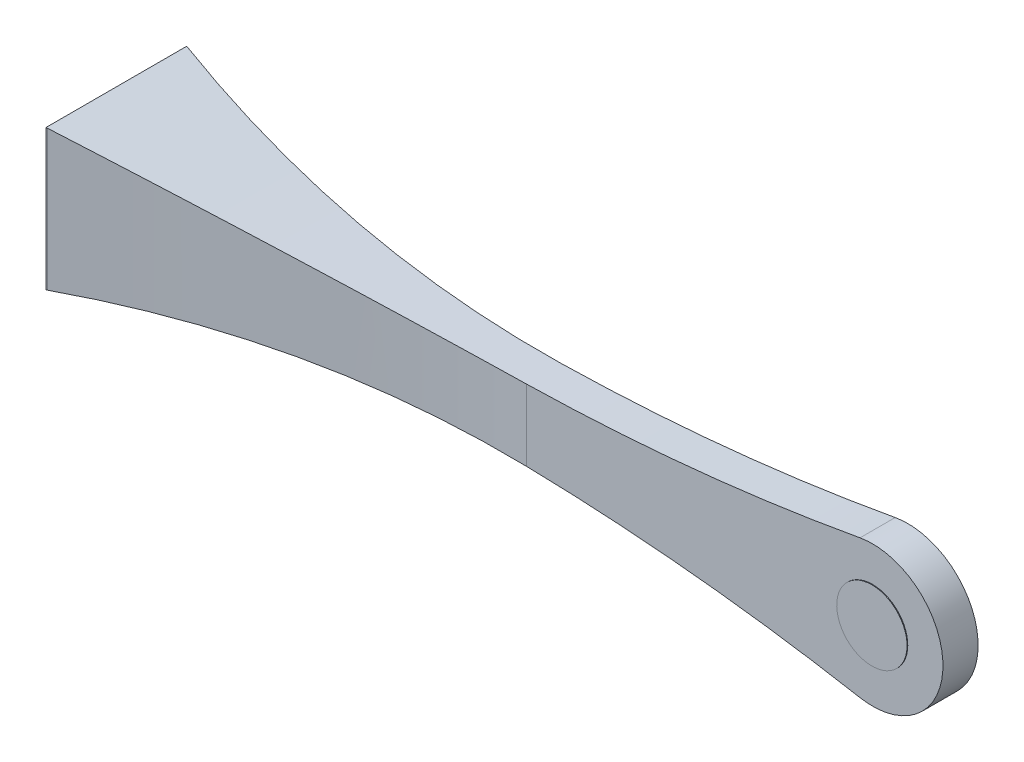
ISO-10303-21;
HEADER;
FILE_DESCRIPTION(('STEP AP214'),'2;1');
FILE_NAME('part.step','',(''),(''),'','','');
FILE_SCHEMA(('AUTOMOTIVE_DESIGN { 1 0 10303 214 1 1 1 1 }'));
ENDSEC;
DATA;
#1=APPLICATION_CONTEXT('core data for automotive mechanical design processes');
#2=APPLICATION_PROTOCOL_DEFINITION('international standard','automotive_design',2000,#1);
#3=PRODUCT_CONTEXT('',#1,'mechanical');
#4=PRODUCT('Part','Part','',(#3));
#5=PRODUCT_RELATED_PRODUCT_CATEGORY('part','',(#4));
#6=PRODUCT_DEFINITION_FORMATION('','',#4);
#7=PRODUCT_DEFINITION_CONTEXT('part definition',#1,'design');
#8=PRODUCT_DEFINITION('design','',#6,#7);
#9=PRODUCT_DEFINITION_SHAPE('','',#8);
#10=(LENGTH_UNIT() NAMED_UNIT(*) SI_UNIT(.MILLI.,.METRE.));
#11=(NAMED_UNIT(*) PLANE_ANGLE_UNIT() SI_UNIT($,.RADIAN.));
#12=(NAMED_UNIT(*) SI_UNIT($,.STERADIAN.) SOLID_ANGLE_UNIT());
#13=UNCERTAINTY_MEASURE_WITH_UNIT(LENGTH_MEASURE(1.E-05),#10,'distance_accuracy_value','');
#14=(GEOMETRIC_REPRESENTATION_CONTEXT(3) GLOBAL_UNCERTAINTY_ASSIGNED_CONTEXT((#13)) GLOBAL_UNIT_ASSIGNED_CONTEXT((#10,
#11,#12)) REPRESENTATION_CONTEXT('',''));
#15=CARTESIAN_POINT('',(0.,0.,0.));
#16=DIRECTION('',(0.,0.,1.));
#17=DIRECTION('',(1.,0.,0.));
#18=AXIS2_PLACEMENT_3D('',#15,#16,#17);
#19=CARTESIAN_POINT('',(-55.4545454545455,305.020661157025,2.50000000000107));
#20=DIRECTION('',(0.,0.,-1.));
#21=DIRECTION('',(0.,1.,0.));
#22=AXIS2_PLACEMENT_3D('',#19,#20,#21);
#23=PLANE('',#22);
#24=CARTESIAN_POINT('',(-55.4545454545455,305.020661157025,2.50000000000107));
#25=DIRECTION('',(0.,0.,-1.));
#26=DIRECTION('',(0.,1.,0.));
#27=AXIS2_PLACEMENT_3D('',#24,#25,#26);
#28=CIRCLE('',#27,300.020661157025);
#29=CARTESIAN_POINT('',(-1.78873708763747,9.83872042652454,2.50000000000003));
#30=VERTEX_POINT('',#29);
#31=CARTESIAN_POINT('',(-49.2235935955851,5.06471045754363,2.50000000000002));
#32=VERTEX_POINT('',#31);
#33=EDGE_CURVE('E163',#30,#32,#28,.T.);
#34=ORIENTED_EDGE('',*,*,#33,.T.);
#35=DIRECTION('',(0.,-1.,0.));
#36=VECTOR('',#35,1.);
#37=CARTESIAN_POINT('',(-49.2235935955851,-6.00574884953593,2.49999999999998));
#38=LINE('',#37,#36);
#39=CARTESIAN_POINT('',(-49.2235935955851,-5.06471045754365,2.49999999999998));
#40=VERTEX_POINT('',#39);
#41=EDGE_CURVE('E182',#32,#40,#38,.T.);
#42=ORIENTED_EDGE('',*,*,#41,.T.);
#43=CARTESIAN_POINT('',(-55.4545454545454,-305.020661157025,2.49999999999894));
#44=DIRECTION('',(0.,0.,-1.));
#45=DIRECTION('',(0.,-1.,0.));
#46=AXIS2_PLACEMENT_3D('',#43,#44,#45);
#47=CIRCLE('',#46,300.020661157025);
#48=CARTESIAN_POINT('',(-1.78873708763746,-9.83872042652456,2.49999999999997));
#49=VERTEX_POINT('',#48);
#50=EDGE_CURVE('E165',#40,#49,#47,.T.);
#51=ORIENTED_EDGE('',*,*,#50,.T.);
#52=CARTESIAN_POINT('',(0.,0.,2.5));
#53=DIRECTION('',(0.,0.,1.));
#54=DIRECTION('',(0.,1.,0.));
#55=AXIS2_PLACEMENT_3D('',#52,#53,#54);
#56=CIRCLE('',#55,10.0000000000001);
#57=EDGE_CURVE('E170',#49,#30,#56,.T.);
#58=ORIENTED_EDGE('',*,*,#57,.T.);
#59=EDGE_LOOP('',(#34,#42,#51,#58));
#60=FACE_BOUND('',#59,.T.);
#61=CARTESIAN_POINT('',(0.,0.,2.5));
#62=DIRECTION('',(0.,0.,1.));
#63=DIRECTION('',(0.,-1.,0.));
#64=AXIS2_PLACEMENT_3D('',#61,#62,#63);
#65=CIRCLE('',#64,5.);
#66=CARTESIAN_POINT('',(0.,-5.00000000000001,2.49999999999998));
#67=VERTEX_POINT('',#66);
#68=EDGE_CURVE('E160',#67,#67,#65,.T.);
#69=ORIENTED_EDGE('',*,*,#68,.F.);
#70=EDGE_LOOP('',(#69));
#71=FACE_BOUND('',#70,.T.);
#72=ADVANCED_FACE('F49',(#60,#71),#23,.F.);
#73=CARTESIAN_POINT('',(-55.4545454545455,305.020661157025,-2.49999999999894));
#74=DIRECTION('',(0.,0.,-1.));
#75=DIRECTION('',(0.,1.,0.));
#76=AXIS2_PLACEMENT_3D('',#73,#74,#75);
#77=PLANE('',#76);
#78=CARTESIAN_POINT('',(-55.4545454545454,-305.020661157025,-2.50000000000107));
#79=DIRECTION('',(0.,0.,-1.));
#80=DIRECTION('',(0.,-1.,0.));
#81=AXIS2_PLACEMENT_3D('',#78,#79,#80);
#82=CIRCLE('',#81,300.020661157025);
#83=CARTESIAN_POINT('',(-49.223593595585,-5.06471045754363,-2.50000000000002));
#84=VERTEX_POINT('',#83);
#85=CARTESIAN_POINT('',(-1.78873708763746,-9.83872042652454,-2.50000000000003));
#86=VERTEX_POINT('',#85);
#87=EDGE_CURVE('E171',#84,#86,#82,.T.);
#88=ORIENTED_EDGE('',*,*,#87,.F.);
#89=DIRECTION('',(0.,-1.,0.));
#90=VECTOR('',#89,1.);
#91=CARTESIAN_POINT('',(-49.223593595585,305.020661157025,-2.49999999999894));
#92=LINE('',#91,#90);
#93=CARTESIAN_POINT('',(-49.223593595585,5.06471045754365,-2.49999999999998));
#94=VERTEX_POINT('',#93);
#95=EDGE_CURVE('E189',#84,#94,#92,.F.);
#96=ORIENTED_EDGE('',*,*,#95,.T.);
#97=CARTESIAN_POINT('',(-55.4545454545455,305.020661157025,-2.49999999999894));
#98=DIRECTION('',(0.,0.,-1.));
#99=DIRECTION('',(0.,1.,0.));
#100=AXIS2_PLACEMENT_3D('',#97,#98,#99);
#101=CIRCLE('',#100,300.020661157025);
#102=CARTESIAN_POINT('',(-1.78873708763747,9.83872042652455,-2.49999999999997));
#103=VERTEX_POINT('',#102);
#104=EDGE_CURVE('E156',#103,#94,#101,.T.);
#105=ORIENTED_EDGE('',*,*,#104,.F.);
#106=CARTESIAN_POINT('',(0.,0.,-2.5));
#107=DIRECTION('',(0.,0.,1.));
#108=DIRECTION('',(0.,1.,0.));
#109=AXIS2_PLACEMENT_3D('',#106,#107,#108);
#110=CIRCLE('',#109,10.0000000000001);
#111=EDGE_CURVE('E164',#86,#103,#110,.T.);
#112=ORIENTED_EDGE('',*,*,#111,.F.);
#113=EDGE_LOOP('',(#88,#96,#105,#112));
#114=FACE_BOUND('',#113,.T.);
#115=CARTESIAN_POINT('',(0.,0.,-2.5));
#116=DIRECTION('',(0.,0.,-1.));
#117=DIRECTION('',(0.,1.,0.));
#118=AXIS2_PLACEMENT_3D('',#115,#116,#117);
#119=CIRCLE('',#118,5.);
#120=CARTESIAN_POINT('',(0.,5.00000000000001,-2.49999999999998));
#121=VERTEX_POINT('',#120);
#122=EDGE_CURVE('E153',#121,#121,#119,.F.);
#123=ORIENTED_EDGE('',*,*,#122,.T.);
#124=EDGE_LOOP('',(#123));
#125=FACE_BOUND('',#124,.T.);
#126=ADVANCED_FACE('F221',(#114,#125),#77,.T.);
#127=CARTESIAN_POINT('',(-55.4545454545455,305.020661157025,2.50000000000107));
#128=DIRECTION('',(0.,0.,-1.));
#129=DIRECTION('',(0.,1.,0.));
#130=AXIS2_PLACEMENT_3D('',#127,#128,#129);
#131=CYLINDRICAL_SURFACE('',#130,300.020661157025);
#132=ORIENTED_EDGE('',*,*,#104,.T.);
#133=CARTESIAN_POINT('',(-49.223593595585,5.06471045754365,-2.49999999999998));
#134=CARTESIAN_POINT('',(-50.5094833667524,5.03799734430642,-2.4999988111242));
#135=CARTESIAN_POINT('',(-51.7955093690425,5.01955718244819,-2.50992160296873));
#136=CARTESIAN_POINT('',(-54.3673848533679,4.99921380423304,-2.54961407652035));
#137=CARTESIAN_POINT('',(-55.6532343355444,4.99731057456236,-2.57938374224884));
#138=CARTESIAN_POINT('',(-59.5096731019534,5.01639193986034,-2.69845607791141));
#139=CARTESIAN_POINT('',(-62.0793274092757,5.06216396496447,-2.81752208663287));
#140=CARTESIAN_POINT('',(-67.1958716472145,5.21897727917521,-3.13374890342736));
#141=CARTESIAN_POINT('',(-69.7428044056206,5.32961556237744,-3.33042508376594));
#142=CARTESIAN_POINT('',(-74.8258782215376,5.61520336530785,-3.80131155859663));
#143=CARTESIAN_POINT('',(-77.3620193176332,5.79015265490064,-4.07552157563496));
#144=CARTESIAN_POINT('',(-82.4194635886218,6.20344766291101,-4.70063360314545));
#145=CARTESIAN_POINT('',(-84.9407676772623,6.441789434596,-5.05153083892977));
#146=CARTESIAN_POINT('',(-89.9650252313705,6.98071770715919,-5.82896781371866));
#147=CARTESIAN_POINT('',(-92.4679784044726,7.2813051975111,-6.25550875515926));
#148=CARTESIAN_POINT('',(-97.4673887478705,7.94539358243608,-7.18583435993211));
#149=CARTESIAN_POINT('',(-99.9637094598861,8.30927293750086,-7.69008147971291));
#150=CARTESIAN_POINT('',(-104.930672061337,9.09695622699466,-8.77231012271923));
#151=CARTESIAN_POINT('',(-107.401315089459,9.52075749188678,-9.35028836109186));
#152=CARTESIAN_POINT('',(-109.857499854669,9.97368917860187,-9.96437496366719));
#153=B_SPLINE_CURVE_WITH_KNOTS('',3,(#133,#134,#135,#136,#137,#138,#139,#140,#141,#142,#143,
#144,#145,#146,#147,#148,#149,#150,#151,#152),.UNSPECIFIED.,.F.,.F.,(4,2,2,2,2,2,2,2,2,4),(0.,
3.85836555019018,7.71672799403778,15.432929042457,23.1016908419773,30.7704251992854,
38.4386822229894,46.1070611526087,53.8229778084948,61.5385508265014),.UNSPECIFIED.);
#154=CARTESIAN_POINT('',(-109.857499854669,9.97368917860184,-9.96437496366718));
#155=VERTEX_POINT('',#154);
#156=EDGE_CURVE('E63',#94,#155,#153,.T.);
#157=ORIENTED_EDGE('',*,*,#156,.T.);
#158=CARTESIAN_POINT('',(-55.4545454545455,305.020661157025,3.63636363636488));
#159=DIRECTION('',(0.242535625036336,0.,-0.970142500145331));
#160=DIRECTION('',(-0.970142500145331,0.,-0.242535625036336));
#161=AXIS2_PLACEMENT_3D('',#158,#159,#160);
#162=ELLIPSE('',#161,309.254218954515,300.020661157025);
#163=CARTESIAN_POINT('',(-110.,10.0000000000001,-10.));
#164=VERTEX_POINT('',#163);
#165=EDGE_CURVE('E129',#155,#164,#162,.T.);
#166=ORIENTED_EDGE('',*,*,#165,.T.);
#167=DIRECTION('',(0.,0.,-1.));
#168=VECTOR('',#167,1.);
#169=CARTESIAN_POINT('',(-110.,9.99999999999998,2.50000000000004));
#170=LINE('',#169,#168);
#171=CARTESIAN_POINT('',(-110.,10.,10.0000000000001));
#172=VERTEX_POINT('',#171);
#173=EDGE_CURVE('E137',#172,#164,#170,.T.);
#174=ORIENTED_EDGE('',*,*,#173,.F.);
#175=CARTESIAN_POINT('',(-55.4545454545455,305.020661157025,-3.63636363636275));
#176=DIRECTION('',(-0.242535625036336,0.,-0.970142500145331));
#177=DIRECTION('',(0.970142500145331,0.,-0.242535625036336));
#178=AXIS2_PLACEMENT_3D('',#175,#176,#177);
#179=ELLIPSE('',#178,309.254218954515,300.020661157025);
#180=CARTESIAN_POINT('',(-109.857499854669,9.97368917860183,9.96437496366731));
#181=VERTEX_POINT('',#180);
#182=EDGE_CURVE('E128',#172,#181,#179,.F.);
#183=ORIENTED_EDGE('',*,*,#182,.T.);
#184=CARTESIAN_POINT('',(-109.857499854669,9.97368917860183,9.96437496366729));
#185=CARTESIAN_POINT('',(-107.401315089459,9.52075749188678,9.35028836109186));
#186=CARTESIAN_POINT('',(-104.930672061337,9.09695622699465,8.77231012271923));
#187=CARTESIAN_POINT('',(-99.9637094598862,8.3092729375008,7.69008147971294));
#188=CARTESIAN_POINT('',(-97.4673887478706,7.94539358243599,7.18583435993218));
#189=CARTESIAN_POINT('',(-92.4679784044727,7.28130519751106,6.2555087551593));
#190=CARTESIAN_POINT('',(-89.9650252313707,6.98071770715922,5.82896781371865));
#191=CARTESIAN_POINT('',(-84.9407676772624,6.44178943459602,5.05153083892975));
#192=CARTESIAN_POINT('',(-82.419463588622,6.20344766291095,4.70063360314548));
#193=CARTESIAN_POINT('',(-77.3620193176333,5.79015265490054,4.07552157563499));
#194=CARTESIAN_POINT('',(-74.8258782215377,5.6152033653078,3.80131155859662));
#195=CARTESIAN_POINT('',(-69.7428044056207,5.32961556237746,3.33042508376591));
#196=CARTESIAN_POINT('',(-67.1958716472146,5.21897727917526,3.13374890342734));
#197=CARTESIAN_POINT('',(-62.0793274092759,5.06216396496452,2.81752208663288));
#198=CARTESIAN_POINT('',(-59.5096731019535,5.01639193986037,2.69845607791144));
#199=CARTESIAN_POINT('',(-55.6532343355445,4.99731057456236,2.57938374224882));
#200=CARTESIAN_POINT('',(-54.367384853368,4.99921380423303,2.5496140765203));
#201=CARTESIAN_POINT('',(-51.7955093690426,5.01955718244817,2.50992160296868));
#202=CARTESIAN_POINT('',(-50.5094833667525,5.0379973443064,2.49999881112416));
#203=CARTESIAN_POINT('',(-49.2235935955851,5.06471045754363,2.50000000000002));
#204=B_SPLINE_CURVE_WITH_KNOTS('',3,(#184,#185,#186,#187,#188,#189,#190,#191,#192,#193,#194,
#195,#196,#197,#198,#199,#200,#201,#202,#203),.UNSPECIFIED.,.F.,.F.,(4,2,2,2,2,2,2,2,2,4),(0.,
7.71557301800658,15.4314896738927,23.099868603512,30.768125627216,38.4368599845241,
46.1056217840444,53.8218228324636,57.6801852763112,61.5385508265014),.UNSPECIFIED.);
#205=EDGE_CURVE('E200',#181,#32,#204,.T.);
#206=ORIENTED_EDGE('',*,*,#205,.T.);
#207=ORIENTED_EDGE('',*,*,#33,.F.);
#208=DIRECTION('',(0.,0.,-1.));
#209=VECTOR('',#208,1.);
#210=CARTESIAN_POINT('',(-1.78873708763747,9.83872042652454,2.50000000000003));
#211=LINE('',#210,#209);
#212=EDGE_CURVE('E169',#30,#103,#211,.T.);
#213=ORIENTED_EDGE('',*,*,#212,.T.);
#214=EDGE_LOOP('',(#132,#157,#166,#174,#183,#206,#207,#213));
#215=FACE_BOUND('',#214,.T.);
#216=ADVANCED_FACE('F225',(#215),#131,.F.);
#217=CARTESIAN_POINT('',(-55.4545454545454,-305.020661157025,2.49999999999894));
#218=DIRECTION('',(0.,0.,-1.));
#219=DIRECTION('',(0.,1.,0.));
#220=AXIS2_PLACEMENT_3D('',#217,#218,#219);
#221=CYLINDRICAL_SURFACE('',#220,300.020661157025);
#222=DIRECTION('',(0.,0.,-1.));
#223=VECTOR('',#222,1.);
#224=CARTESIAN_POINT('',(-110.,-10.0000000000001,2.49999999999996));
#225=LINE('',#224,#223);
#226=CARTESIAN_POINT('',(-110.,-10.0000000000001,10.));
#227=VERTEX_POINT('',#226);
#228=CARTESIAN_POINT('',(-110.,-10.,-10.0000000000001));
#229=VERTEX_POINT('',#228);
#230=EDGE_CURVE('E124',#227,#229,#225,.T.);
#231=ORIENTED_EDGE('',*,*,#230,.T.);
#232=CARTESIAN_POINT('',(-55.4545454545454,-305.020661157025,3.63636363636277));
#233=DIRECTION('',(0.242535625036336,0.,-0.970142500145331));
#234=DIRECTION('',(-0.970142500145331,0.,-0.242535625036336));
#235=AXIS2_PLACEMENT_3D('',#232,#233,#234);
#236=ELLIPSE('',#235,309.254218954515,300.020661157025);
#237=CARTESIAN_POINT('',(-109.857499854669,-9.97368917860183,-9.96437496366728));
#238=VERTEX_POINT('',#237);
#239=EDGE_CURVE('E177',#229,#238,#236,.T.);
#240=ORIENTED_EDGE('',*,*,#239,.T.);
#241=CARTESIAN_POINT('',(-109.857499854669,-9.97368917860183,-9.96437496366728));
#242=CARTESIAN_POINT('',(-107.401315089459,-9.52075749188677,-9.35028836109183));
#243=CARTESIAN_POINT('',(-104.930672061337,-9.0969562269946,-8.7723101227192));
#244=CARTESIAN_POINT('',(-99.9637094598861,-8.30927293750072,-7.69008147971295));
#245=CARTESIAN_POINT('',(-97.4673887478705,-7.94539358243591,-7.18583435993222));
#246=CARTESIAN_POINT('',(-92.4679784044726,-7.28130519751102,-6.25550875515936));
#247=CARTESIAN_POINT('',(-89.9650252313706,-6.98071770715923,-5.82896781371869));
#248=CARTESIAN_POINT('',(-84.9407676772623,-6.44178943459605,-5.05153083892977));
#249=CARTESIAN_POINT('',(-82.4194635886219,-6.20344766291095,-4.70063360314548));
#250=CARTESIAN_POINT('',(-77.3620193176332,-5.79015265490053,-4.075521575635));
#251=CARTESIAN_POINT('',(-74.8258782215376,-5.6152033653078,-3.80131155859665));
#252=CARTESIAN_POINT('',(-69.7428044056206,-5.32961556237747,-3.33042508376594));
#253=CARTESIAN_POINT('',(-67.1958716472145,-5.21897727917526,-3.13374890342736));
#254=CARTESIAN_POINT('',(-62.0793274092757,-5.06216396496452,-2.81752208663289));
#255=CARTESIAN_POINT('',(-59.5096731019534,-5.01639193986036,-2.69845607791146));
#256=CARTESIAN_POINT('',(-55.6532343355444,-4.99731057456234,-2.57938374224885));
#257=CARTESIAN_POINT('',(-54.3673848533679,-4.99921380423302,-2.54961407652034));
#258=CARTESIAN_POINT('',(-51.7955093690425,-5.01955718244816,-2.50992160296871));
#259=CARTESIAN_POINT('',(-50.5094833667523,-5.03799734430639,-2.4999988111242));
#260=CARTESIAN_POINT('',(-49.2235935955849,-5.06471045754362,-2.50000000000004));
#261=B_SPLINE_CURVE_WITH_KNOTS('',3,(#241,#242,#243,#244,#245,#246,#247,#248,#249,#250,#251,
#252,#253,#254,#255,#256,#257,#258,#259,#260),.UNSPECIFIED.,.F.,.F.,(4,2,2,2,2,2,2,2,2,4),(0.,
7.71557301800659,15.4314896738927,23.099868603512,30.768125627216,38.4368599845241,
46.1056217840445,53.8218228324637,57.6801852763113,61.5385508265015),.UNSPECIFIED.);
#262=EDGE_CURVE('E12',#238,#84,#261,.T.);
#263=ORIENTED_EDGE('',*,*,#262,.T.);
#264=ORIENTED_EDGE('',*,*,#87,.T.);
#265=DIRECTION('',(0.,0.,-1.));
#266=VECTOR('',#265,1.);
#267=CARTESIAN_POINT('',(-1.78873708763746,-9.83872042652456,2.49999999999997));
#268=LINE('',#267,#266);
#269=EDGE_CURVE('E139',#49,#86,#268,.T.);
#270=ORIENTED_EDGE('',*,*,#269,.F.);
#271=ORIENTED_EDGE('',*,*,#50,.F.);
#272=CARTESIAN_POINT('',(-49.2235935955851,-5.06471045754365,2.49999999999998));
#273=CARTESIAN_POINT('',(-50.5094833667525,-5.03799734430633,2.49999881112414));
#274=CARTESIAN_POINT('',(-51.7955093690426,-5.01955718244809,2.50992160296865));
#275=CARTESIAN_POINT('',(-54.367384853368,-4.99921380423299,2.54961407652028));
#276=CARTESIAN_POINT('',(-55.6532343355445,-4.99731057456236,2.57938374224879));
#277=CARTESIAN_POINT('',(-59.5096731019535,-5.01639193986042,2.6984560779114));
#278=CARTESIAN_POINT('',(-62.0793274092759,-5.06216396496449,2.81752208663284));
#279=CARTESIAN_POINT('',(-67.1958716472146,-5.21897727917521,3.1337489034273));
#280=CARTESIAN_POINT('',(-69.7428044056207,-5.32961556237749,3.33042508376588));
#281=CARTESIAN_POINT('',(-74.8258782215377,-5.61520336530785,3.80131155859659));
#282=CARTESIAN_POINT('',(-77.3620193176333,-5.79015265490055,4.07552157563494));
#283=CARTESIAN_POINT('',(-82.419463588622,-6.20344766291096,4.70063360314542));
#284=CARTESIAN_POINT('',(-84.9407676772624,-6.44178943459609,5.05153083892971));
#285=CARTESIAN_POINT('',(-89.9650252313706,-6.98071770715929,5.82896781371862));
#286=CARTESIAN_POINT('',(-92.4679784044727,-7.28130519751109,6.25550875515928));
#287=CARTESIAN_POINT('',(-97.4673887478706,-7.94539358243598,7.18583435993216));
#288=CARTESIAN_POINT('',(-99.9637094598862,-8.30927293750079,7.69008147971292));
#289=CARTESIAN_POINT('',(-104.930672061337,-9.09695622699466,8.77231012271919));
#290=CARTESIAN_POINT('',(-107.401315089459,-9.52075749188681,9.3502883610918));
#291=CARTESIAN_POINT('',(-109.857499854669,-9.97368917860185,9.9643749636672));
#292=B_SPLINE_CURVE_WITH_KNOTS('',3,(#272,#273,#274,#275,#276,#277,#278,#279,#280,#281,#282,
#283,#284,#285,#286,#287,#288,#289,#290,#291),.UNSPECIFIED.,.F.,.F.,(4,2,2,2,2,2,2,2,2,4),(0.,
3.85836555019018,7.71672799403779,15.432929042457,23.1016908419773,30.7704251992854,
38.4386822229894,46.1070611526087,53.8229778084948,61.5385508265014),.UNSPECIFIED.);
#293=CARTESIAN_POINT('',(-109.857499854669,-9.9736891786019,9.96437496366725));
#294=VERTEX_POINT('',#293);
#295=EDGE_CURVE('E123',#40,#294,#292,.T.);
#296=ORIENTED_EDGE('',*,*,#295,.T.);
#297=CARTESIAN_POINT('',(-55.4545454545454,-305.020661157025,-3.6363636363649));
#298=DIRECTION('',(-0.242535625036336,0.,-0.970142500145331));
#299=DIRECTION('',(0.970142500145331,0.,-0.242535625036336));
#300=AXIS2_PLACEMENT_3D('',#297,#298,#299);
#301=ELLIPSE('',#300,309.254218954515,300.020661157025);
#302=EDGE_CURVE('E119',#294,#227,#301,.F.);
#303=ORIENTED_EDGE('',*,*,#302,.T.);
#304=EDGE_LOOP('',(#231,#240,#263,#264,#270,#271,#296,#303));
#305=FACE_BOUND('',#304,.T.);
#306=ADVANCED_FACE('F125',(#305),#221,.F.);
#307=CARTESIAN_POINT('',(0.,0.,2.5));
#308=DIRECTION('',(0.,0.,-1.));
#309=DIRECTION('',(0.,1.,0.));
#310=AXIS2_PLACEMENT_3D('',#307,#308,#309);
#311=CYLINDRICAL_SURFACE('',#310,10.0000000000001);
#312=ORIENTED_EDGE('',*,*,#111,.T.);
#313=ORIENTED_EDGE('',*,*,#212,.F.);
#314=ORIENTED_EDGE('',*,*,#57,.F.);
#315=ORIENTED_EDGE('',*,*,#269,.T.);
#316=EDGE_LOOP('',(#312,#313,#314,#315));
#317=FACE_BOUND('',#316,.T.);
#318=ADVANCED_FACE('F239',(#317),#311,.T.);
#319=CARTESIAN_POINT('',(-55.4545454545455,305.020661157025,-2.59999999999893));
#320=DIRECTION('',(0.,0.,-1.));
#321=DIRECTION('',(0.,1.,0.));
#322=AXIS2_PLACEMENT_3D('',#319,#320,#321);
#323=PLANE('',#322);
#324=CARTESIAN_POINT('',(0.,0.,-2.6));
#325=DIRECTION('',(0.,0.,-1.));
#326=DIRECTION('',(0.,1.,0.));
#327=AXIS2_PLACEMENT_3D('',#324,#325,#326);
#328=CIRCLE('',#327,5.);
#329=CARTESIAN_POINT('',(0.,5.00000000000001,-2.59999999999998));
#330=VERTEX_POINT('',#329);
#331=EDGE_CURVE('E146',#330,#330,#328,.F.);
#332=ORIENTED_EDGE('',*,*,#331,.F.);
#333=EDGE_LOOP('',(#332));
#334=FACE_BOUND('',#333,.T.);
#335=ADVANCED_FACE('F265',(#334),#323,.T.);
#336=CARTESIAN_POINT('',(0.,0.,16.842135623731));
#337=DIRECTION('',(0.,0.,-1.));
#338=DIRECTION('',(0.,1.,0.));
#339=AXIS2_PLACEMENT_3D('',#336,#337,#338);
#340=CYLINDRICAL_SURFACE('',#339,5.);
#341=ORIENTED_EDGE('',*,*,#122,.F.);
#342=EDGE_LOOP('',(#341));
#343=FACE_BOUND('',#342,.T.);
#344=ORIENTED_EDGE('',*,*,#331,.T.);
#345=EDGE_LOOP('',(#344));
#346=FACE_BOUND('',#345,.T.);
#347=ADVANCED_FACE('F258',(#343,#346),#340,.T.);
#348=CARTESIAN_POINT('',(0.,0.,2.6));
#349=DIRECTION('',(0.,0.,-1.));
#350=DIRECTION('',(0.,1.,0.));
#351=AXIS2_PLACEMENT_3D('',#348,#349,#350);
#352=CIRCLE('',#351,5.);
#353=CARTESIAN_POINT('',(0.,4.99999999999999,2.60000000000002));
#354=VERTEX_POINT('',#353);
#355=EDGE_CURVE('E151',#354,#354,#352,.T.);
#356=ORIENTED_EDGE('',*,*,#355,.T.);
#357=EDGE_LOOP('',(#356));
#358=FACE_BOUND('',#357,.T.);
#359=ORIENTED_EDGE('',*,*,#68,.T.);
#360=EDGE_LOOP('',(#359));
#361=FACE_BOUND('',#360,.T.);
#362=ADVANCED_FACE('F301',(#358,#361),#340,.T.);
#363=CARTESIAN_POINT('',(-55.4545454545455,305.020661157025,2.60000000000107));
#364=DIRECTION('',(0.,0.,-1.));
#365=DIRECTION('',(0.,1.,0.));
#366=AXIS2_PLACEMENT_3D('',#363,#364,#365);
#367=PLANE('',#366);
#368=ORIENTED_EDGE('',*,*,#355,.F.);
#369=EDGE_LOOP('',(#368));
#370=FACE_BOUND('',#369,.T.);
#371=ADVANCED_FACE('F222',(#370),#367,.F.);
#372=CARTESIAN_POINT('',(-110.,0.,-10.));
#373=DIRECTION('',(0.242535625036336,0.,-0.970142500145331));
#374=DIRECTION('',(0.,1.,0.));
#375=AXIS2_PLACEMENT_3D('',#372,#373,#374);
#376=PLANE('',#375);
#377=ORIENTED_EDGE('',*,*,#165,.F.);
#378=DIRECTION('',(0.,1.,0.));
#379=VECTOR('',#378,1.);
#380=CARTESIAN_POINT('',(-109.857499854669,0.,-9.96437496366725));
#381=LINE('',#380,#379);
#382=EDGE_CURVE('E71',#155,#238,#381,.F.);
#383=ORIENTED_EDGE('',*,*,#382,.T.);
#384=ORIENTED_EDGE('',*,*,#239,.F.);
#385=DIRECTION('',(0.,-1.,0.));
#386=VECTOR('',#385,1.);
#387=CARTESIAN_POINT('',(-110.,10.0000000000001,-10.));
#388=LINE('',#387,#386);
#389=EDGE_CURVE('E138',#164,#229,#388,.T.);
#390=ORIENTED_EDGE('',*,*,#389,.F.);
#391=EDGE_LOOP('',(#377,#383,#384,#390));
#392=FACE_BOUND('',#391,.T.);
#393=ADVANCED_FACE('F217',(#392),#376,.T.);
#394=CARTESIAN_POINT('',(-80.0000000000004,305.020661157025,2.50000000000107));
#395=DIRECTION('',(-0.242535625036336,0.,-0.970142500145331));
#396=DIRECTION('',(0.,-1.,0.));
#397=AXIS2_PLACEMENT_3D('',#394,#395,#396);
#398=PLANE('',#397);
#399=ORIENTED_EDGE('',*,*,#302,.F.);
#400=DIRECTION('',(0.,-1.,0.));
#401=VECTOR('',#400,1.);
#402=CARTESIAN_POINT('',(-109.857499854669,6.00574884953588,9.96437496366728));
#403=LINE('',#402,#401);
#404=EDGE_CURVE('E187',#294,#181,#403,.F.);
#405=ORIENTED_EDGE('',*,*,#404,.T.);
#406=ORIENTED_EDGE('',*,*,#182,.F.);
#407=DIRECTION('',(0.,1.,0.));
#408=VECTOR('',#407,1.);
#409=CARTESIAN_POINT('',(-110.,10.,10.0000000000001));
#410=LINE('',#409,#408);
#411=EDGE_CURVE('E132',#227,#172,#410,.T.);
#412=ORIENTED_EDGE('',*,*,#411,.F.);
#413=EDGE_LOOP('',(#399,#405,#406,#412));
#414=FACE_BOUND('',#413,.T.);
#415=ADVANCED_FACE('F141',(#414),#398,.F.);
#416=CARTESIAN_POINT('',(-110.,0.,0.));
#417=DIRECTION('',(1.,0.,0.));
#418=DIRECTION('',(0.,1.,0.));
#419=AXIS2_PLACEMENT_3D('',#416,#417,#418);
#420=PLANE('',#419);
#421=ORIENTED_EDGE('',*,*,#230,.F.);
#422=ORIENTED_EDGE('',*,*,#411,.T.);
#423=ORIENTED_EDGE('',*,*,#173,.T.);
#424=ORIENTED_EDGE('',*,*,#389,.T.);
#425=EDGE_LOOP('',(#421,#422,#423,#424));
#426=FACE_BOUND('',#425,.T.);
#427=ADVANCED_FACE('F131',(#426),#420,.F.);
#428=CARTESIAN_POINT('',(-49.2235935955851,305.020661157024,252.500000000001));
#429=DIRECTION('',(0.,1.,0.));
#430=DIRECTION('',(-1.,0.,0.));
#431=AXIS2_PLACEMENT_3D('',#428,#429,#430);
#432=CYLINDRICAL_SURFACE('',#431,250.);
#433=ORIENTED_EDGE('',*,*,#205,.F.);
#434=ORIENTED_EDGE('',*,*,#404,.F.);
#435=ORIENTED_EDGE('',*,*,#295,.F.);
#436=ORIENTED_EDGE('',*,*,#41,.F.);
#437=EDGE_LOOP('',(#433,#434,#435,#436));
#438=FACE_BOUND('',#437,.T.);
#439=ADVANCED_FACE('F204',(#438),#432,.F.);
#440=CARTESIAN_POINT('',(-49.223593595585,305.020661157026,-252.499999999999));
#441=DIRECTION('',(0.,-1.,0.));
#442=DIRECTION('',(1.,0.,0.));
#443=AXIS2_PLACEMENT_3D('',#440,#441,#442);
#444=CYLINDRICAL_SURFACE('',#443,250.);
#445=ORIENTED_EDGE('',*,*,#262,.F.);
#446=ORIENTED_EDGE('',*,*,#382,.F.);
#447=ORIENTED_EDGE('',*,*,#156,.F.);
#448=ORIENTED_EDGE('',*,*,#95,.F.);
#449=EDGE_LOOP('',(#445,#446,#447,#448));
#450=FACE_BOUND('',#449,.T.);
#451=ADVANCED_FACE('F55',(#450),#444,.F.);
#452=CLOSED_SHELL('',(#72,#126,#216,#306,#318,#335,#347,#362,#371,#393,#415,#427,#439,#451));
#453=MANIFOLD_SOLID_BREP('B2',#452);
#454=ADVANCED_BREP_SHAPE_REPRESENTATION('',(#18,#453),#14);
#455=SHAPE_DEFINITION_REPRESENTATION(#9,#454);
ENDSEC;
END-ISO-10303-21;
